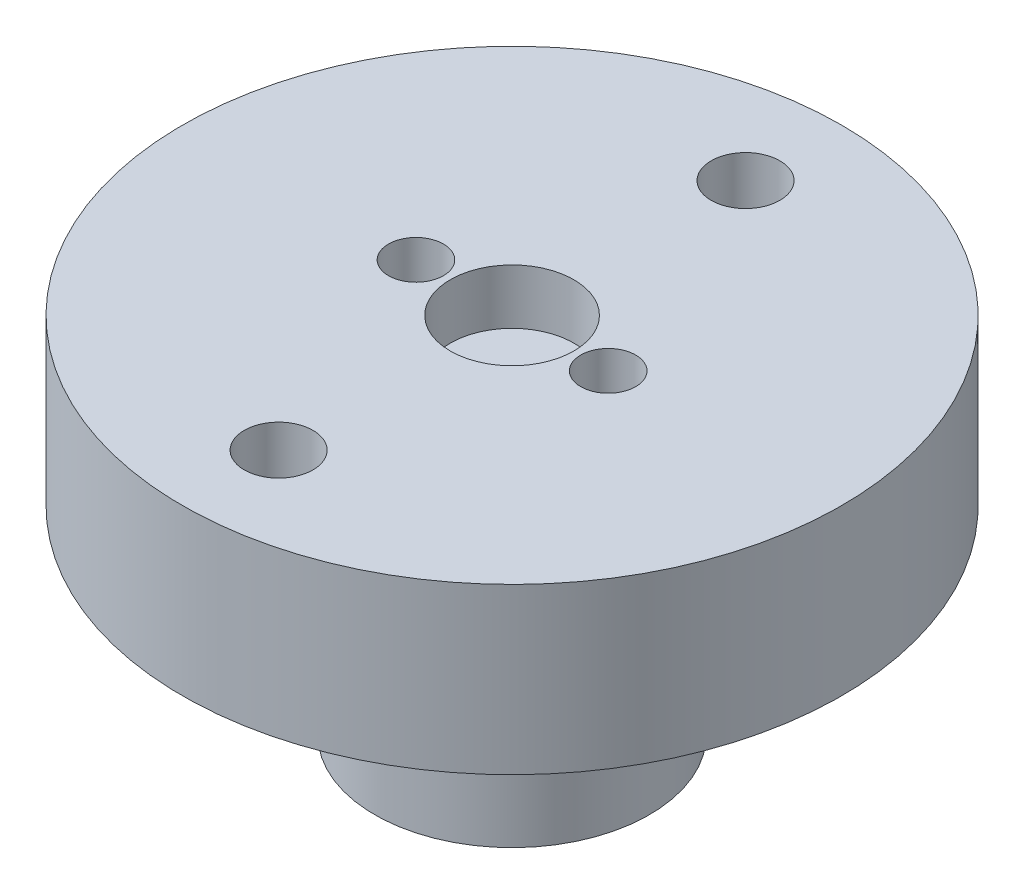
ISO-10303-21;
HEADER;
FILE_DESCRIPTION(('STEP AP214'),'2;1');
FILE_NAME('part.step','',(''),(''),'','','');
FILE_SCHEMA(('AUTOMOTIVE_DESIGN { 1 0 10303 214 1 1 1 1 }'));
ENDSEC;
DATA;
#1=APPLICATION_CONTEXT('core data for automotive mechanical design processes');
#2=APPLICATION_PROTOCOL_DEFINITION('international standard','automotive_design',2000,#1);
#3=PRODUCT_CONTEXT('',#1,'mechanical');
#4=PRODUCT('Part','Part','',(#3));
#5=PRODUCT_RELATED_PRODUCT_CATEGORY('part','',(#4));
#6=PRODUCT_DEFINITION_FORMATION('','',#4);
#7=PRODUCT_DEFINITION_CONTEXT('part definition',#1,'design');
#8=PRODUCT_DEFINITION('design','',#6,#7);
#9=PRODUCT_DEFINITION_SHAPE('','',#8);
#10=(LENGTH_UNIT() NAMED_UNIT(*) SI_UNIT(.MILLI.,.METRE.));
#11=(NAMED_UNIT(*) PLANE_ANGLE_UNIT() SI_UNIT($,.RADIAN.));
#12=(NAMED_UNIT(*) SI_UNIT($,.STERADIAN.) SOLID_ANGLE_UNIT());
#13=UNCERTAINTY_MEASURE_WITH_UNIT(LENGTH_MEASURE(1.E-05),#10,'distance_accuracy_value','');
#14=(GEOMETRIC_REPRESENTATION_CONTEXT(3) GLOBAL_UNCERTAINTY_ASSIGNED_CONTEXT((#13)) GLOBAL_UNIT_ASSIGNED_CONTEXT((#10,
#11,#12)) REPRESENTATION_CONTEXT('',''));
#15=CARTESIAN_POINT('',(0.,0.,0.));
#16=DIRECTION('',(0.,0.,1.));
#17=DIRECTION('',(1.,0.,0.));
#18=AXIS2_PLACEMENT_3D('',#15,#16,#17);
#19=CARTESIAN_POINT('',(0.,0.,0.));
#20=DIRECTION('',(0.,-1.,0.));
#21=DIRECTION('',(0.,0.,-1.));
#22=AXIS2_PLACEMENT_3D('',#19,#20,#21);
#23=CYLINDRICAL_SURFACE('',#22,6.);
#24=DIRECTION('',(0.,-1.,0.));
#25=VECTOR('',#24,1.);
#26=CARTESIAN_POINT('',(0.959432040305829,4.,-5.92279411764706));
#27=LINE('',#26,#25);
#28=CARTESIAN_POINT('',(0.959432040305829,7.25,-5.92279411764706));
#29=VERTEX_POINT('',#28);
#30=CARTESIAN_POINT('',(0.959432040305832,5.25,-5.92279411764706));
#31=VERTEX_POINT('',#30);
#32=EDGE_CURVE('E47',#29,#31,#27,.T.);
#33=ORIENTED_EDGE('',*,*,#32,.F.);
#34=CARTESIAN_POINT('',(0.,7.25,0.));
#35=DIRECTION('',(0.,-1.,0.));
#36=DIRECTION('',(0.,0.,-1.));
#37=AXIS2_PLACEMENT_3D('',#34,#35,#36);
#38=CIRCLE('',#37,6.);
#39=CARTESIAN_POINT('',(0.959432040305828,7.25,5.92279411764706));
#40=VERTEX_POINT('',#39);
#41=EDGE_CURVE('E90',#29,#40,#38,.T.);
#42=ORIENTED_EDGE('',*,*,#41,.T.);
#43=DIRECTION('',(0.,-1.,0.));
#44=VECTOR('',#43,1.);
#45=CARTESIAN_POINT('',(0.959432040305828,4.,5.92279411764706));
#46=LINE('',#45,#44);
#47=CARTESIAN_POINT('',(0.959432040305831,5.25,5.92279411764706));
#48=VERTEX_POINT('',#47);
#49=EDGE_CURVE('E107',#48,#40,#46,.F.);
#50=ORIENTED_EDGE('',*,*,#49,.F.);
#51=CARTESIAN_POINT('',(0.,5.25,0.));
#52=DIRECTION('',(0.,-1.,0.));
#53=DIRECTION('',(0.,0.,-1.));
#54=AXIS2_PLACEMENT_3D('',#51,#52,#53);
#55=CIRCLE('',#54,6.);
#56=EDGE_CURVE('E91',#31,#48,#55,.T.);
#57=ORIENTED_EDGE('',*,*,#56,.F.);
#58=EDGE_LOOP('',(#33,#42,#50,#57));
#59=FACE_BOUND('',#58,.T.);
#60=ADVANCED_FACE('F33',(#59),#23,.T.);
#61=CARTESIAN_POINT('',(0.,3.25,-8.5));
#62=DIRECTION('',(0.,1.,0.));
#63=DIRECTION('',(0.,0.,1.));
#64=AXIS2_PLACEMENT_3D('',#61,#62,#63);
#65=CYLINDRICAL_SURFACE('',#64,1.25);
#66=CARTESIAN_POINT('',(0.,13.25,-8.5));
#67=DIRECTION('',(0.,1.,0.));
#68=DIRECTION('',(0.,0.,1.));
#69=AXIS2_PLACEMENT_3D('',#66,#67,#68);
#70=CIRCLE('',#69,1.25);
#71=CARTESIAN_POINT('',(0.,13.25,-7.25));
#72=VERTEX_POINT('',#71);
#73=EDGE_CURVE('E136',#72,#72,#70,.T.);
#74=ORIENTED_EDGE('',*,*,#73,.T.);
#75=EDGE_LOOP('',(#74));
#76=FACE_BOUND('',#75,.T.);
#77=CARTESIAN_POINT('',(0.,8.,-8.5));
#78=DIRECTION('',(0.,-1.,0.));
#79=DIRECTION('',(0.,0.,-1.));
#80=AXIS2_PLACEMENT_3D('',#77,#78,#79);
#81=CIRCLE('',#80,1.25);
#82=CARTESIAN_POINT('',(0.,8.,-9.75));
#83=VERTEX_POINT('',#82);
#84=EDGE_CURVE('E86',#83,#83,#81,.F.);
#85=ORIENTED_EDGE('',*,*,#84,.F.);
#86=EDGE_LOOP('',(#85));
#87=FACE_BOUND('',#86,.T.);
#88=ADVANCED_FACE('F170',(#76,#87),#65,.F.);
#89=CARTESIAN_POINT('',(0.,3.25,8.5));
#90=DIRECTION('',(0.,1.,0.));
#91=DIRECTION('',(0.,0.,1.));
#92=AXIS2_PLACEMENT_3D('',#89,#90,#91);
#93=CYLINDRICAL_SURFACE('',#92,1.25);
#94=CARTESIAN_POINT('',(0.,13.25,8.5));
#95=DIRECTION('',(0.,1.,0.));
#96=DIRECTION('',(0.,0.,1.));
#97=AXIS2_PLACEMENT_3D('',#94,#95,#96);
#98=CIRCLE('',#97,1.25);
#99=CARTESIAN_POINT('',(0.,13.25,9.75));
#100=VERTEX_POINT('',#99);
#101=EDGE_CURVE('E133',#100,#100,#98,.T.);
#102=ORIENTED_EDGE('',*,*,#101,.T.);
#103=EDGE_LOOP('',(#102));
#104=FACE_BOUND('',#103,.T.);
#105=CARTESIAN_POINT('',(0.,8.,8.5));
#106=DIRECTION('',(0.,-1.,0.));
#107=DIRECTION('',(0.,0.,-1.));
#108=AXIS2_PLACEMENT_3D('',#105,#106,#107);
#109=CIRCLE('',#108,1.25);
#110=CARTESIAN_POINT('',(0.,8.,7.25));
#111=VERTEX_POINT('',#110);
#112=EDGE_CURVE('E104',#111,#111,#109,.F.);
#113=ORIENTED_EDGE('',*,*,#112,.F.);
#114=EDGE_LOOP('',(#113));
#115=FACE_BOUND('',#114,.T.);
#116=ADVANCED_FACE('F175',(#104,#115),#93,.F.);
#117=CARTESIAN_POINT('',(0.,0.,0.));
#118=DIRECTION('',(0.,-1.,0.));
#119=DIRECTION('',(0.,0.,-1.));
#120=AXIS2_PLACEMENT_3D('',#117,#118,#119);
#121=PLANE('',#120);
#122=CARTESIAN_POINT('',(-3.5,0.,0.));
#123=DIRECTION('',(0.,1.,0.));
#124=DIRECTION('',(0.,0.,-1.));
#125=AXIS2_PLACEMENT_3D('',#122,#123,#124);
#126=CIRCLE('',#125,0.999999999999999);
#127=CARTESIAN_POINT('',(-3.5,0.,-0.999999999999999));
#128=VERTEX_POINT('',#127);
#129=EDGE_CURVE('E140',#128,#128,#126,.T.);
#130=ORIENTED_EDGE('',*,*,#129,.T.);
#131=EDGE_LOOP('',(#130));
#132=FACE_BOUND('',#131,.T.);
#133=CARTESIAN_POINT('',(3.5,0.,0.));
#134=DIRECTION('',(0.,1.,0.));
#135=DIRECTION('',(0.,0.,1.));
#136=AXIS2_PLACEMENT_3D('',#133,#134,#135);
#137=CIRCLE('',#136,0.999999999999999);
#138=CARTESIAN_POINT('',(3.5,0.,0.999999999999999));
#139=VERTEX_POINT('',#138);
#140=EDGE_CURVE('E146',#139,#139,#137,.T.);
#141=ORIENTED_EDGE('',*,*,#140,.T.);
#142=EDGE_LOOP('',(#141));
#143=FACE_BOUND('',#142,.T.);
#144=CARTESIAN_POINT('',(0.,0.,0.));
#145=DIRECTION('',(0.,-1.,0.));
#146=DIRECTION('',(0.,0.,-1.));
#147=AXIS2_PLACEMENT_3D('',#144,#145,#146);
#148=CIRCLE('',#147,5.);
#149=CARTESIAN_POINT('',(0.,0.,-5.));
#150=VERTEX_POINT('',#149);
#151=EDGE_CURVE('E149',#150,#150,#148,.T.);
#152=ORIENTED_EDGE('',*,*,#151,.T.);
#153=EDGE_LOOP('',(#152));
#154=FACE_BOUND('',#153,.T.);
#155=ADVANCED_FACE('F35',(#132,#143,#154),#121,.T.);
#156=CARTESIAN_POINT('',(0.,13.25,0.));
#157=DIRECTION('',(0.,1.,0.));
#158=DIRECTION('',(0.,0.,1.));
#159=AXIS2_PLACEMENT_3D('',#156,#157,#158);
#160=PLANE('',#159);
#161=CARTESIAN_POINT('',(0.,13.25,0.));
#162=DIRECTION('',(0.,1.,0.));
#163=DIRECTION('',(0.,0.,1.));
#164=AXIS2_PLACEMENT_3D('',#161,#162,#163);
#165=CIRCLE('',#164,2.25);
#166=CARTESIAN_POINT('',(0.,13.25,2.25));
#167=VERTEX_POINT('',#166);
#168=EDGE_CURVE('E119',#167,#167,#165,.T.);
#169=ORIENTED_EDGE('',*,*,#168,.F.);
#170=EDGE_LOOP('',(#169));
#171=FACE_BOUND('',#170,.T.);
#172=ORIENTED_EDGE('',*,*,#101,.F.);
#173=EDGE_LOOP('',(#172));
#174=FACE_BOUND('',#173,.T.);
#175=ORIENTED_EDGE('',*,*,#73,.F.);
#176=EDGE_LOOP('',(#175));
#177=FACE_BOUND('',#176,.T.);
#178=CARTESIAN_POINT('',(-3.5,13.25,0.));
#179=DIRECTION('',(0.,1.,0.));
#180=DIRECTION('',(0.,0.,-1.));
#181=AXIS2_PLACEMENT_3D('',#178,#179,#180);
#182=CIRCLE('',#181,0.999999999999999);
#183=CARTESIAN_POINT('',(-3.5,13.25,-0.999999999999999));
#184=VERTEX_POINT('',#183);
#185=EDGE_CURVE('E139',#184,#184,#182,.T.);
#186=ORIENTED_EDGE('',*,*,#185,.F.);
#187=EDGE_LOOP('',(#186));
#188=FACE_BOUND('',#187,.T.);
#189=CARTESIAN_POINT('',(3.5,13.25,0.));
#190=DIRECTION('',(0.,1.,0.));
#191=DIRECTION('',(0.,0.,1.));
#192=AXIS2_PLACEMENT_3D('',#189,#190,#191);
#193=CIRCLE('',#192,0.999999999999999);
#194=CARTESIAN_POINT('',(3.5,13.25,0.999999999999999));
#195=VERTEX_POINT('',#194);
#196=EDGE_CURVE('E143',#195,#195,#193,.T.);
#197=ORIENTED_EDGE('',*,*,#196,.F.);
#198=EDGE_LOOP('',(#197));
#199=FACE_BOUND('',#198,.T.);
#200=CARTESIAN_POINT('',(0.,13.25,0.));
#201=DIRECTION('',(0.,-1.,0.));
#202=DIRECTION('',(0.,0.,-1.));
#203=AXIS2_PLACEMENT_3D('',#200,#201,#202);
#204=CIRCLE('',#203,12.);
#205=CARTESIAN_POINT('',(0.,13.25,-12.));
#206=VERTEX_POINT('',#205);
#207=EDGE_CURVE('E101',#206,#206,#204,.T.);
#208=ORIENTED_EDGE('',*,*,#207,.F.);
#209=EDGE_LOOP('',(#208));
#210=FACE_BOUND('',#209,.T.);
#211=ADVANCED_FACE('F184',(#171,#174,#177,#188,#199,#210),#160,.T.);
#212=CARTESIAN_POINT('',(0.,0.,0.));
#213=DIRECTION('',(0.,-1.,0.));
#214=DIRECTION('',(0.,0.,-1.));
#215=AXIS2_PLACEMENT_3D('',#212,#213,#214);
#216=CYLINDRICAL_SURFACE('',#215,12.);
#217=ORIENTED_EDGE('',*,*,#207,.T.);
#218=EDGE_LOOP('',(#217));
#219=FACE_BOUND('',#218,.T.);
#220=CARTESIAN_POINT('',(0.,7.25,0.));
#221=DIRECTION('',(0.,-1.,0.));
#222=DIRECTION('',(0.,0.,-1.));
#223=AXIS2_PLACEMENT_3D('',#220,#221,#222);
#224=CIRCLE('',#223,12.);
#225=CARTESIAN_POINT('',(0.,7.25,-12.));
#226=VERTEX_POINT('',#225);
#227=EDGE_CURVE('E98',#226,#226,#224,.T.);
#228=ORIENTED_EDGE('',*,*,#227,.F.);
#229=EDGE_LOOP('',(#228));
#230=FACE_BOUND('',#229,.T.);
#231=ADVANCED_FACE('F181',(#219,#230),#216,.T.);
#232=CARTESIAN_POINT('',(6.,7.25,0.));
#233=DIRECTION('',(0.,-1.,0.));
#234=DIRECTION('',(0.,0.,-1.));
#235=AXIS2_PLACEMENT_3D('',#232,#233,#234);
#236=PLANE('',#235);
#237=CARTESIAN_POINT('',(0.,7.25,-8.5));
#238=DIRECTION('',(0.,-1.,0.));
#239=DIRECTION('',(0.,0.,-1.));
#240=AXIS2_PLACEMENT_3D('',#237,#238,#239);
#241=CIRCLE('',#240,2.75);
#242=CARTESIAN_POINT('',(-0.959432040305827,7.25,-5.92279411764706));
#243=VERTEX_POINT('',#242);
#244=EDGE_CURVE('E124',#243,#29,#241,.T.);
#245=ORIENTED_EDGE('',*,*,#244,.F.);
#246=CARTESIAN_POINT('',(-0.959432040305828,7.25,5.92279411764706));
#247=VERTEX_POINT('',#246);
#248=EDGE_CURVE('E85',#247,#243,#38,.T.);
#249=ORIENTED_EDGE('',*,*,#248,.F.);
#250=CARTESIAN_POINT('',(0.,7.25,8.5));
#251=DIRECTION('',(0.,-1.,0.));
#252=DIRECTION('',(0.,0.,-1.));
#253=AXIS2_PLACEMENT_3D('',#250,#251,#252);
#254=CIRCLE('',#253,2.75);
#255=EDGE_CURVE('E131',#40,#247,#254,.T.);
#256=ORIENTED_EDGE('',*,*,#255,.F.);
#257=ORIENTED_EDGE('',*,*,#41,.F.);
#258=EDGE_LOOP('',(#245,#249,#256,#257));
#259=FACE_BOUND('',#258,.T.);
#260=ORIENTED_EDGE('',*,*,#227,.T.);
#261=EDGE_LOOP('',(#260));
#262=FACE_BOUND('',#261,.T.);
#263=ADVANCED_FACE('F167',(#259,#262),#236,.T.);
#264=DIRECTION('',(0.,-1.,0.));
#265=VECTOR('',#264,1.);
#266=CARTESIAN_POINT('',(-0.959432040305827,4.,-5.92279411764706));
#267=LINE('',#266,#265);
#268=CARTESIAN_POINT('',(-0.95943204030583,5.25,-5.92279411764706));
#269=VERTEX_POINT('',#268);
#270=EDGE_CURVE('E74',#269,#243,#267,.F.);
#271=ORIENTED_EDGE('',*,*,#270,.F.);
#272=CARTESIAN_POINT('',(-0.959432040305831,5.25,5.92279411764706));
#273=VERTEX_POINT('',#272);
#274=EDGE_CURVE('E83',#273,#269,#55,.T.);
#275=ORIENTED_EDGE('',*,*,#274,.F.);
#276=DIRECTION('',(0.,-1.,0.));
#277=VECTOR('',#276,1.);
#278=CARTESIAN_POINT('',(-0.959432040305828,4.,5.92279411764706));
#279=LINE('',#278,#277);
#280=EDGE_CURVE('E55',#247,#273,#279,.T.);
#281=ORIENTED_EDGE('',*,*,#280,.F.);
#282=ORIENTED_EDGE('',*,*,#248,.T.);
#283=EDGE_LOOP('',(#271,#275,#281,#282));
#284=FACE_BOUND('',#283,.T.);
#285=ADVANCED_FACE('F82',(#284),#23,.T.);
#286=CARTESIAN_POINT('',(6.,5.25,0.));
#287=DIRECTION('',(0.,-1.,0.));
#288=DIRECTION('',(0.,0.,-1.));
#289=AXIS2_PLACEMENT_3D('',#286,#287,#288);
#290=PLANE('',#289);
#291=CARTESIAN_POINT('',(0.,5.25,-8.5));
#292=DIRECTION('',(0.,-1.,0.));
#293=DIRECTION('',(0.,0.,-1.));
#294=AXIS2_PLACEMENT_3D('',#291,#292,#293);
#295=CIRCLE('',#294,2.75);
#296=EDGE_CURVE('E11',#31,#269,#295,.T.);
#297=ORIENTED_EDGE('',*,*,#296,.F.);
#298=ORIENTED_EDGE('',*,*,#56,.T.);
#299=CARTESIAN_POINT('',(0.,5.25,8.5));
#300=DIRECTION('',(0.,-1.,0.));
#301=DIRECTION('',(0.,0.,-1.));
#302=AXIS2_PLACEMENT_3D('',#299,#300,#301);
#303=CIRCLE('',#302,2.75);
#304=EDGE_CURVE('E41',#273,#48,#303,.T.);
#305=ORIENTED_EDGE('',*,*,#304,.F.);
#306=ORIENTED_EDGE('',*,*,#274,.T.);
#307=EDGE_LOOP('',(#297,#298,#305,#306));
#308=FACE_BOUND('',#307,.T.);
#309=CARTESIAN_POINT('',(0.,5.25,0.));
#310=DIRECTION('',(0.,-1.,0.));
#311=DIRECTION('',(0.,0.,-1.));
#312=AXIS2_PLACEMENT_3D('',#309,#310,#311);
#313=CIRCLE('',#312,5.);
#314=CARTESIAN_POINT('',(0.,5.25,-5.));
#315=VERTEX_POINT('',#314);
#316=EDGE_CURVE('E94',#315,#315,#313,.T.);
#317=ORIENTED_EDGE('',*,*,#316,.F.);
#318=EDGE_LOOP('',(#317));
#319=FACE_BOUND('',#318,.T.);
#320=ADVANCED_FACE('F88',(#308,#319),#290,.T.);
#321=CARTESIAN_POINT('',(0.,0.,0.));
#322=DIRECTION('',(0.,-1.,0.));
#323=DIRECTION('',(0.,0.,-1.));
#324=AXIS2_PLACEMENT_3D('',#321,#322,#323);
#325=CYLINDRICAL_SURFACE('',#324,5.);
#326=ORIENTED_EDGE('',*,*,#316,.T.);
#327=EDGE_LOOP('',(#326));
#328=FACE_BOUND('',#327,.T.);
#329=ORIENTED_EDGE('',*,*,#151,.F.);
#330=EDGE_LOOP('',(#329));
#331=FACE_BOUND('',#330,.T.);
#332=ADVANCED_FACE('F157',(#328,#331),#325,.T.);
#333=CARTESIAN_POINT('',(3.5,0.,0.));
#334=DIRECTION('',(0.,1.,0.));
#335=DIRECTION('',(0.,0.,1.));
#336=AXIS2_PLACEMENT_3D('',#333,#334,#335);
#337=CYLINDRICAL_SURFACE('',#336,0.999999999999999);
#338=ORIENTED_EDGE('',*,*,#140,.F.);
#339=EDGE_LOOP('',(#338));
#340=FACE_BOUND('',#339,.T.);
#341=ORIENTED_EDGE('',*,*,#196,.T.);
#342=EDGE_LOOP('',(#341));
#343=FACE_BOUND('',#342,.T.);
#344=ADVANCED_FACE('F165',(#340,#343),#337,.F.);
#345=CARTESIAN_POINT('',(-3.5,0.,0.));
#346=DIRECTION('',(0.,1.,0.));
#347=DIRECTION('',(0.,0.,1.));
#348=AXIS2_PLACEMENT_3D('',#345,#346,#347);
#349=CYLINDRICAL_SURFACE('',#348,0.999999999999999);
#350=ORIENTED_EDGE('',*,*,#129,.F.);
#351=EDGE_LOOP('',(#350));
#352=FACE_BOUND('',#351,.T.);
#353=ORIENTED_EDGE('',*,*,#185,.T.);
#354=EDGE_LOOP('',(#353));
#355=FACE_BOUND('',#354,.T.);
#356=ADVANCED_FACE('F209',(#352,#355),#349,.F.);
#357=CARTESIAN_POINT('',(0.,8.,8.5));
#358=DIRECTION('',(0.,-1.,0.));
#359=DIRECTION('',(0.,0.,-1.));
#360=AXIS2_PLACEMENT_3D('',#357,#358,#359);
#361=PLANE('',#360);
#362=CARTESIAN_POINT('',(0.,8.,8.5));
#363=DIRECTION('',(0.,-1.,0.));
#364=DIRECTION('',(0.,0.,-1.));
#365=AXIS2_PLACEMENT_3D('',#362,#363,#364);
#366=CIRCLE('',#365,2.75);
#367=CARTESIAN_POINT('',(0.,8.,5.75));
#368=VERTEX_POINT('',#367);
#369=EDGE_CURVE('E108',#368,#368,#366,.T.);
#370=ORIENTED_EDGE('',*,*,#369,.T.);
#371=EDGE_LOOP('',(#370));
#372=FACE_BOUND('',#371,.T.);
#373=ORIENTED_EDGE('',*,*,#112,.T.);
#374=EDGE_LOOP('',(#373));
#375=FACE_BOUND('',#374,.T.);
#376=ADVANCED_FACE('F215',(#372,#375),#361,.T.);
#377=CARTESIAN_POINT('',(0.,8.,8.5));
#378=DIRECTION('',(0.,-1.,0.));
#379=DIRECTION('',(0.,0.,-1.));
#380=AXIS2_PLACEMENT_3D('',#377,#378,#379);
#381=CYLINDRICAL_SURFACE('',#380,2.75);
#382=ORIENTED_EDGE('',*,*,#255,.T.);
#383=ORIENTED_EDGE('',*,*,#280,.T.);
#384=ORIENTED_EDGE('',*,*,#304,.T.);
#385=ORIENTED_EDGE('',*,*,#49,.T.);
#386=EDGE_LOOP('',(#382,#383,#384,#385));
#387=FACE_BOUND('',#386,.T.);
#388=ORIENTED_EDGE('',*,*,#369,.F.);
#389=EDGE_LOOP('',(#388));
#390=FACE_BOUND('',#389,.T.);
#391=ADVANCED_FACE('F223',(#387,#390),#381,.F.);
#392=CARTESIAN_POINT('',(0.,8.,-8.5));
#393=DIRECTION('',(0.,-1.,0.));
#394=DIRECTION('',(0.,0.,-1.));
#395=AXIS2_PLACEMENT_3D('',#392,#393,#394);
#396=PLANE('',#395);
#397=CARTESIAN_POINT('',(0.,8.,-8.5));
#398=DIRECTION('',(0.,-1.,0.));
#399=DIRECTION('',(0.,0.,-1.));
#400=AXIS2_PLACEMENT_3D('',#397,#398,#399);
#401=CIRCLE('',#400,2.75);
#402=CARTESIAN_POINT('',(0.,8.,-11.25));
#403=VERTEX_POINT('',#402);
#404=EDGE_CURVE('E110',#403,#403,#401,.T.);
#405=ORIENTED_EDGE('',*,*,#404,.T.);
#406=EDGE_LOOP('',(#405));
#407=FACE_BOUND('',#406,.T.);
#408=ORIENTED_EDGE('',*,*,#84,.T.);
#409=EDGE_LOOP('',(#408));
#410=FACE_BOUND('',#409,.T.);
#411=ADVANCED_FACE('F226',(#407,#410),#396,.T.);
#412=CARTESIAN_POINT('',(0.,8.,-8.5));
#413=DIRECTION('',(0.,-1.,0.));
#414=DIRECTION('',(0.,0.,-1.));
#415=AXIS2_PLACEMENT_3D('',#412,#413,#414);
#416=CYLINDRICAL_SURFACE('',#415,2.75);
#417=ORIENTED_EDGE('',*,*,#244,.T.);
#418=ORIENTED_EDGE('',*,*,#32,.T.);
#419=ORIENTED_EDGE('',*,*,#296,.T.);
#420=ORIENTED_EDGE('',*,*,#270,.T.);
#421=EDGE_LOOP('',(#417,#418,#419,#420));
#422=FACE_BOUND('',#421,.T.);
#423=ORIENTED_EDGE('',*,*,#404,.F.);
#424=EDGE_LOOP('',(#423));
#425=FACE_BOUND('',#424,.T.);
#426=ADVANCED_FACE('F72',(#422,#425),#416,.F.);
#427=CARTESIAN_POINT('',(0.,11.25,0.));
#428=DIRECTION('',(0.,1.,0.));
#429=DIRECTION('',(0.,0.,1.));
#430=AXIS2_PLACEMENT_3D('',#427,#428,#429);
#431=CYLINDRICAL_SURFACE('',#430,2.25);
#432=CARTESIAN_POINT('',(0.,11.25,0.));
#433=DIRECTION('',(0.,1.,0.));
#434=DIRECTION('',(0.,0.,1.));
#435=AXIS2_PLACEMENT_3D('',#432,#433,#434);
#436=CIRCLE('',#435,2.25);
#437=CARTESIAN_POINT('',(0.,11.25,2.25));
#438=VERTEX_POINT('',#437);
#439=EDGE_CURVE('E114',#438,#438,#436,.T.);
#440=ORIENTED_EDGE('',*,*,#439,.F.);
#441=EDGE_LOOP('',(#440));
#442=FACE_BOUND('',#441,.T.);
#443=ORIENTED_EDGE('',*,*,#168,.T.);
#444=EDGE_LOOP('',(#443));
#445=FACE_BOUND('',#444,.T.);
#446=ADVANCED_FACE('F232',(#442,#445),#431,.F.);
#447=CARTESIAN_POINT('',(0.,11.25,0.));
#448=DIRECTION('',(0.,1.,0.));
#449=DIRECTION('',(0.,0.,1.));
#450=AXIS2_PLACEMENT_3D('',#447,#448,#449);
#451=PLANE('',#450);
#452=ORIENTED_EDGE('',*,*,#439,.T.);
#453=EDGE_LOOP('',(#452));
#454=FACE_BOUND('',#453,.T.);
#455=ADVANCED_FACE('F237',(#454),#451,.T.);
#456=CLOSED_SHELL('',(#60,#88,#116,#155,#211,#231,#263,#285,#320,#332,#344,#356,#376,#391,#411,
#426,#446,#455));
#457=MANIFOLD_SOLID_BREP('B2',#456);
#458=ADVANCED_BREP_SHAPE_REPRESENTATION('',(#18,#457),#14);
#459=SHAPE_DEFINITION_REPRESENTATION(#9,#458);
ENDSEC;
END-ISO-10303-21;
